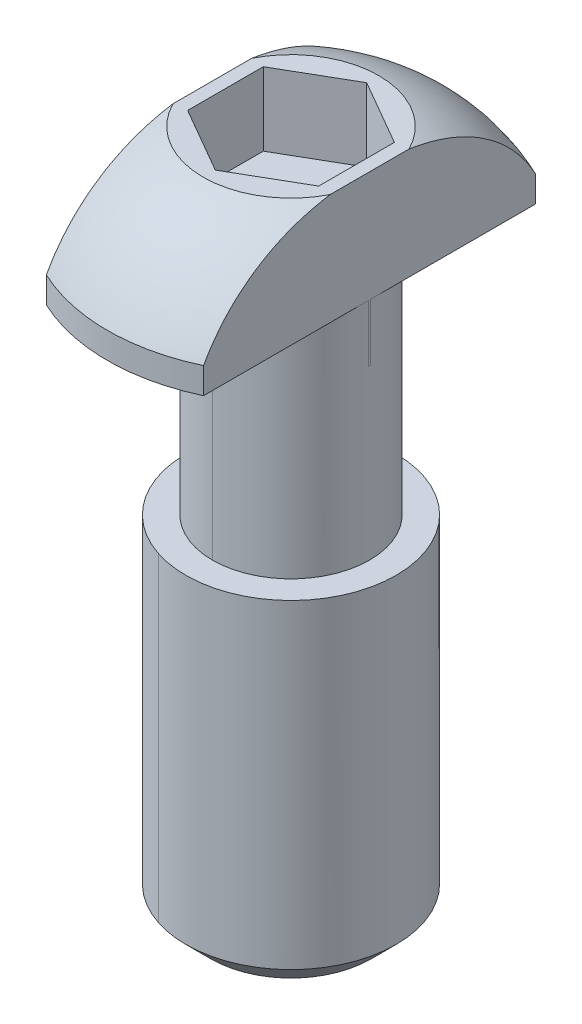
ISO-10303-21;
HEADER;
FILE_DESCRIPTION(('STEP AP214'),'2;1');
FILE_NAME('part.step','',(''),(''),'','','');
FILE_SCHEMA(('AUTOMOTIVE_DESIGN { 1 0 10303 214 1 1 1 1 }'));
ENDSEC;
DATA;
#1=APPLICATION_CONTEXT('core data for automotive mechanical design processes');
#2=APPLICATION_PROTOCOL_DEFINITION('international standard','automotive_design',2000,#1);
#3=PRODUCT_CONTEXT('',#1,'mechanical');
#4=PRODUCT('Part','Part','',(#3));
#5=PRODUCT_RELATED_PRODUCT_CATEGORY('part','',(#4));
#6=PRODUCT_DEFINITION_FORMATION('','',#4);
#7=PRODUCT_DEFINITION_CONTEXT('part definition',#1,'design');
#8=PRODUCT_DEFINITION('design','',#6,#7);
#9=PRODUCT_DEFINITION_SHAPE('','',#8);
#10=(LENGTH_UNIT() NAMED_UNIT(*) SI_UNIT(.MILLI.,.METRE.));
#11=(NAMED_UNIT(*) PLANE_ANGLE_UNIT() SI_UNIT($,.RADIAN.));
#12=(NAMED_UNIT(*) SI_UNIT($,.STERADIAN.) SOLID_ANGLE_UNIT());
#13=UNCERTAINTY_MEASURE_WITH_UNIT(LENGTH_MEASURE(1.E-05),#10,'distance_accuracy_value','');
#14=(GEOMETRIC_REPRESENTATION_CONTEXT(3) GLOBAL_UNCERTAINTY_ASSIGNED_CONTEXT((#13)) GLOBAL_UNIT_ASSIGNED_CONTEXT((#10,
#11,#12)) REPRESENTATION_CONTEXT('',''));
#15=CARTESIAN_POINT('',(0.,0.,0.));
#16=DIRECTION('',(0.,0.,1.));
#17=DIRECTION('',(1.,0.,0.));
#18=AXIS2_PLACEMENT_3D('',#15,#16,#17);
#19=CARTESIAN_POINT('',(0.,15.7755421503726,0.));
#20=DIRECTION('',(0.,-1.,0.));
#21=DIRECTION('',(0.,0.,1.));
#22=AXIS2_PLACEMENT_3D('',#19,#20,#21);
#23=DEGENERATE_TOROIDAL_SURFACE('',#22,0.988366273500756,5.0799999999994,.T.);
#24=CARTESIAN_POINT('',(2.375,18.01114,-5.01616138097649));
#25=CARTESIAN_POINT('',(2.375,18.296576088637,-4.86138537455025));
#26=CARTESIAN_POINT('',(2.375,18.5689443575255,-4.67488824016125));
#27=CARTESIAN_POINT('',(2.375,19.2212313011707,-4.12269419155696));
#28=CARTESIAN_POINT('',(2.375,19.5721331044173,-3.70706406030373));
#29=CARTESIAN_POINT('',(2.375,20.1286836369885,-2.78432721767959));
#30=CARTESIAN_POINT('',(2.375,20.3355947611015,-2.26376015241012));
#31=CARTESIAN_POINT('',(2.375,20.5097082248342,-1.5533172329614));
#32=CARTESIAN_POINT('',(2.375,20.5457387158703,-1.37075905535062));
#33=CARTESIAN_POINT('',(2.375,20.574,-1.18912975079946));
#34=B_SPLINE_CURVE_WITH_KNOTS('',3,(#24,#25,#26,#27,#28,#29,#30,#31,#32,#33),.UNSPECIFIED.,.F.,
.F.,(4,2,2,2,4),(0.,0.204715293386292,0.538826349685439,0.884108894617601,1.),.UNSPECIFIED.);
#35=CARTESIAN_POINT('',(2.375,18.01114,-5.01616138097649));
#36=VERTEX_POINT('',#35);
#37=CARTESIAN_POINT('',(2.375,20.574,-1.18912975079947));
#38=VERTEX_POINT('',#37);
#39=EDGE_CURVE('E11',#36,#38,#34,.T.);
#40=ORIENTED_EDGE('',*,*,#39,.F.);
#41=CARTESIAN_POINT('',(0.,18.01114,0.));
#42=DIRECTION('',(0.,-1.,0.));
#43=DIRECTION('',(0.,0.,-1.));
#44=AXIS2_PLACEMENT_3D('',#41,#42,#43);
#45=CIRCLE('',#44,5.55);
#46=CARTESIAN_POINT('',(-2.375,18.01114,-5.01616138097649));
#47=VERTEX_POINT('',#46);
#48=EDGE_CURVE('E25',#47,#36,#45,.T.);
#49=ORIENTED_EDGE('',*,*,#48,.F.);
#50=CARTESIAN_POINT('',(-2.375,20.574,-1.18912975079947));
#51=CARTESIAN_POINT('',(-2.375,20.5089898144888,-1.60693648346493));
#52=CARTESIAN_POINT('',(-2.375,20.4025539673415,-2.02614001549125));
#53=CARTESIAN_POINT('',(-2.375,20.0499067943608,-2.94622753582735));
#54=CARTESIAN_POINT('',(-2.375,19.7613219505825,-3.44693596717502));
#55=CARTESIAN_POINT('',(-2.375,19.0381711075084,-4.31048182302075));
#56=CARTESIAN_POINT('',(-2.375,18.5932028382873,-4.68481890109435));
#57=CARTESIAN_POINT('',(-2.375,18.0734367274535,-4.98191931533658));
#58=CARTESIAN_POINT('',(-2.375,18.0417829785444,-4.99954540972085));
#59=CARTESIAN_POINT('',(-2.375,18.01114,-5.01616138097649));
#60=B_SPLINE_CURVE_WITH_KNOTS('',3,(#50,#51,#52,#53,#54,#55,#56,#57,#58,#59),.UNSPECIFIED.,.F.,
.F.,(4,2,2,2,4),(0.,0.266934110498165,0.62205086055326,0.97799421636308,1.),.UNSPECIFIED.);
#61=CARTESIAN_POINT('',(-2.375,20.574,-1.18912975079947));
#62=VERTEX_POINT('',#61);
#63=EDGE_CURVE('E387',#62,#47,#60,.T.);
#64=ORIENTED_EDGE('',*,*,#63,.F.);
#65=CARTESIAN_POINT('',(0.,20.574,0.));
#66=DIRECTION('',(0.,-1.,0.));
#67=DIRECTION('',(0.,0.,-1.));
#68=AXIS2_PLACEMENT_3D('',#65,#66,#67);
#69=CIRCLE('',#68,2.65605997);
#70=EDGE_CURVE('E394',#62,#38,#69,.T.);
#71=ORIENTED_EDGE('',*,*,#70,.T.);
#72=EDGE_LOOP('',(#40,#49,#64,#71));
#73=FACE_BOUND('',#72,.T.);
#74=ADVANCED_FACE('F16',(#73),#23,.T.);
#75=CARTESIAN_POINT('',(0.,20.574,0.));
#76=DIRECTION('',(0.,-1.,0.));
#77=DIRECTION('',(0.,0.,-1.));
#78=AXIS2_PLACEMENT_3D('',#75,#76,#77);
#79=PLANE('',#78);
#80=DIRECTION('',(0.,0.,-1.));
#81=VECTOR('',#80,1.);
#82=CARTESIAN_POINT('',(2.375,20.574,0.));
#83=LINE('',#82,#81);
#84=CARTESIAN_POINT('',(2.375,20.574,1.18912975079947));
#85=VERTEX_POINT('',#84);
#86=EDGE_CURVE('E396',#85,#38,#83,.T.);
#87=ORIENTED_EDGE('',*,*,#86,.T.);
#88=ORIENTED_EDGE('',*,*,#70,.F.);
#89=DIRECTION('',(0.,0.,1.));
#90=VECTOR('',#89,1.);
#91=CARTESIAN_POINT('',(-2.375,20.574,0.));
#92=LINE('',#91,#90);
#93=CARTESIAN_POINT('',(-2.375,20.574,1.18912975079947));
#94=VERTEX_POINT('',#93);
#95=EDGE_CURVE('E391',#62,#94,#92,.T.);
#96=ORIENTED_EDGE('',*,*,#95,.T.);
#97=CARTESIAN_POINT('',(0.,20.574,0.));
#98=DIRECTION('',(0.,-1.,0.));
#99=DIRECTION('',(0.,0.,-1.));
#100=AXIS2_PLACEMENT_3D('',#97,#98,#99);
#101=CIRCLE('',#100,2.65605997);
#102=EDGE_CURVE('E425',#85,#94,#101,.T.);
#103=ORIENTED_EDGE('',*,*,#102,.F.);
#104=EDGE_LOOP('',(#87,#88,#96,#103));
#105=FACE_BOUND('',#104,.T.);
#106=DIRECTION('',(0.86602540378445,0.,-0.499999999999981));
#107=VECTOR('',#106,1.);
#108=CARTESIAN_POINT('',(0.,20.574,2.2863070659909));
#109=LINE('',#108,#107);
#110=CARTESIAN_POINT('',(0.,20.574,2.2863070659909));
#111=VERTEX_POINT('',#110);
#112=CARTESIAN_POINT('',(1.98,20.574,1.1431535329955));
#113=VERTEX_POINT('',#112);
#114=EDGE_CURVE('E430',#111,#113,#109,.T.);
#115=ORIENTED_EDGE('',*,*,#114,.F.);
#116=DIRECTION('',(0.86602540378445,0.,0.499999999999981));
#117=VECTOR('',#116,1.);
#118=CARTESIAN_POINT('',(-1.98,20.574,1.1431535329955));
#119=LINE('',#118,#117);
#120=CARTESIAN_POINT('',(-1.98,20.574,1.1431535329955));
#121=VERTEX_POINT('',#120);
#122=EDGE_CURVE('E435',#121,#111,#119,.T.);
#123=ORIENTED_EDGE('',*,*,#122,.F.);
#124=DIRECTION('',(0.,0.,1.));
#125=VECTOR('',#124,1.);
#126=CARTESIAN_POINT('',(-1.98,20.574,-1.1431535329955));
#127=LINE('',#126,#125);
#128=CARTESIAN_POINT('',(-1.98,20.574,-1.1431535329955));
#129=VERTEX_POINT('',#128);
#130=EDGE_CURVE('E440',#129,#121,#127,.T.);
#131=ORIENTED_EDGE('',*,*,#130,.F.);
#132=DIRECTION('',(-0.86602540378445,0.,0.499999999999981));
#133=VECTOR('',#132,1.);
#134=CARTESIAN_POINT('',(0.,20.574,-2.2863070659909));
#135=LINE('',#134,#133);
#136=CARTESIAN_POINT('',(0.,20.574,-2.2863070659909));
#137=VERTEX_POINT('',#136);
#138=EDGE_CURVE('E445',#137,#129,#135,.T.);
#139=ORIENTED_EDGE('',*,*,#138,.F.);
#140=DIRECTION('',(-0.86602540378445,0.,-0.499999999999981));
#141=VECTOR('',#140,1.);
#142=CARTESIAN_POINT('',(1.98,20.574,-1.1431535329955));
#143=LINE('',#142,#141);
#144=CARTESIAN_POINT('',(1.98,20.574,-1.1431535329955));
#145=VERTEX_POINT('',#144);
#146=EDGE_CURVE('E450',#145,#137,#143,.T.);
#147=ORIENTED_EDGE('',*,*,#146,.F.);
#148=DIRECTION('',(0.,0.,1.));
#149=VECTOR('',#148,1.);
#150=CARTESIAN_POINT('',(1.98,20.574,0.));
#151=LINE('',#150,#149);
#152=EDGE_CURVE('E455',#145,#113,#151,.T.);
#153=ORIENTED_EDGE('',*,*,#152,.T.);
#154=EDGE_LOOP('',(#115,#123,#131,#139,#147,#153));
#155=FACE_BOUND('',#154,.T.);
#156=ADVANCED_FACE('F568',(#105,#155),#79,.F.);
#157=CARTESIAN_POINT('',(1.98,18.3642,1.1431535329955));
#158=DIRECTION('',(1.,0.,0.));
#159=DIRECTION('',(0.,0.,-1.));
#160=AXIS2_PLACEMENT_3D('',#157,#158,#159);
#161=PLANE('',#160);
#162=DIRECTION('',(0.,1.,0.));
#163=VECTOR('',#162,1.);
#164=CARTESIAN_POINT('',(1.98,18.3642,1.1431535329955));
#165=LINE('',#164,#163);
#166=CARTESIAN_POINT('',(1.98,18.3642,1.1431535329955));
#167=VERTEX_POINT('',#166);
#168=EDGE_CURVE('E459',#167,#113,#165,.T.);
#169=ORIENTED_EDGE('',*,*,#168,.T.);
#170=ORIENTED_EDGE('',*,*,#152,.F.);
#171=DIRECTION('',(0.,1.,0.));
#172=VECTOR('',#171,1.);
#173=CARTESIAN_POINT('',(1.98,18.3642,-1.1431535329955));
#174=LINE('',#173,#172);
#175=CARTESIAN_POINT('',(1.98,18.3642,-1.1431535329955));
#176=VERTEX_POINT('',#175);
#177=EDGE_CURVE('E464',#176,#145,#174,.T.);
#178=ORIENTED_EDGE('',*,*,#177,.F.);
#179=DIRECTION('',(0.,0.,-1.));
#180=VECTOR('',#179,1.);
#181=CARTESIAN_POINT('',(1.98,18.3642,1.1431535329955));
#182=LINE('',#181,#180);
#183=EDGE_CURVE('E469',#167,#176,#182,.T.);
#184=ORIENTED_EDGE('',*,*,#183,.F.);
#185=EDGE_LOOP('',(#169,#170,#178,#184));
#186=FACE_BOUND('',#185,.T.);
#187=ADVANCED_FACE('F598',(#186),#161,.F.);
#188=CARTESIAN_POINT('',(0.,18.3642,0.));
#189=DIRECTION('',(0.,1.,0.));
#190=DIRECTION('',(0.,0.,1.));
#191=AXIS2_PLACEMENT_3D('',#188,#189,#190);
#192=PLANE('',#191);
#193=DIRECTION('',(0.,0.,1.));
#194=VECTOR('',#193,1.);
#195=CARTESIAN_POINT('',(-1.98,18.3642,-1.1431535329955));
#196=LINE('',#195,#194);
#197=CARTESIAN_POINT('',(-1.98,18.3642,-1.1431535329955));
#198=VERTEX_POINT('',#197);
#199=CARTESIAN_POINT('',(-1.98,18.3642,1.1431535329955));
#200=VERTEX_POINT('',#199);
#201=EDGE_CURVE('E474',#198,#200,#196,.T.);
#202=ORIENTED_EDGE('',*,*,#201,.T.);
#203=DIRECTION('',(0.86602540378445,0.,0.499999999999981));
#204=VECTOR('',#203,1.);
#205=CARTESIAN_POINT('',(-1.98,18.3642,1.1431535329955));
#206=LINE('',#205,#204);
#207=CARTESIAN_POINT('',(0.,18.3642,2.2863070659909));
#208=VERTEX_POINT('',#207);
#209=EDGE_CURVE('E478',#200,#208,#206,.T.);
#210=ORIENTED_EDGE('',*,*,#209,.T.);
#211=DIRECTION('',(0.86602540378445,0.,-0.499999999999981));
#212=VECTOR('',#211,1.);
#213=CARTESIAN_POINT('',(0.,18.3642,2.2863070659909));
#214=LINE('',#213,#212);
#215=EDGE_CURVE('E482',#208,#167,#214,.T.);
#216=ORIENTED_EDGE('',*,*,#215,.T.);
#217=ORIENTED_EDGE('',*,*,#183,.T.);
#218=DIRECTION('',(-0.86602540378445,0.,-0.499999999999981));
#219=VECTOR('',#218,1.);
#220=CARTESIAN_POINT('',(1.98,18.3642,-1.1431535329955));
#221=LINE('',#220,#219);
#222=CARTESIAN_POINT('',(0.,18.3642,-2.2863070659909));
#223=VERTEX_POINT('',#222);
#224=EDGE_CURVE('E487',#176,#223,#221,.T.);
#225=ORIENTED_EDGE('',*,*,#224,.T.);
#226=DIRECTION('',(-0.86602540378445,0.,0.499999999999981));
#227=VECTOR('',#226,1.);
#228=CARTESIAN_POINT('',(0.,18.3642,-2.2863070659909));
#229=LINE('',#228,#227);
#230=EDGE_CURVE('E491',#223,#198,#229,.T.);
#231=ORIENTED_EDGE('',*,*,#230,.T.);
#232=EDGE_LOOP('',(#202,#210,#216,#217,#225,#231));
#233=FACE_BOUND('',#232,.T.);
#234=ADVANCED_FACE('F602',(#233),#192,.T.);
#235=CARTESIAN_POINT('',(0.,18.3642,-2.2863070659909));
#236=DIRECTION('',(-0.499999999999981,0.,-0.86602540378445));
#237=DIRECTION('',(-0.86602540378445,0.,0.499999999999981));
#238=AXIS2_PLACEMENT_3D('',#235,#236,#237);
#239=PLANE('',#238);
#240=ORIENTED_EDGE('',*,*,#138,.T.);
#241=DIRECTION('',(0.,1.,0.));
#242=VECTOR('',#241,1.);
#243=CARTESIAN_POINT('',(-1.98,18.3642,-1.1431535329955));
#244=LINE('',#243,#242);
#245=EDGE_CURVE('E495',#198,#129,#244,.T.);
#246=ORIENTED_EDGE('',*,*,#245,.F.);
#247=ORIENTED_EDGE('',*,*,#230,.F.);
#248=DIRECTION('',(0.,1.,0.));
#249=VECTOR('',#248,1.);
#250=CARTESIAN_POINT('',(0.,18.3642,-2.2863070659909));
#251=LINE('',#250,#249);
#252=EDGE_CURVE('E500',#223,#137,#251,.T.);
#253=ORIENTED_EDGE('',*,*,#252,.T.);
#254=EDGE_LOOP('',(#240,#246,#247,#253));
#255=FACE_BOUND('',#254,.T.);
#256=ADVANCED_FACE('F608',(#255),#239,.F.);
#257=CARTESIAN_POINT('',(1.98,18.3642,-1.1431535329955));
#258=DIRECTION('',(0.499999999999981,0.,-0.86602540378445));
#259=DIRECTION('',(-0.86602540378445,0.,-0.499999999999981));
#260=AXIS2_PLACEMENT_3D('',#257,#258,#259);
#261=PLANE('',#260);
#262=ORIENTED_EDGE('',*,*,#146,.T.);
#263=ORIENTED_EDGE('',*,*,#252,.F.);
#264=ORIENTED_EDGE('',*,*,#224,.F.);
#265=ORIENTED_EDGE('',*,*,#177,.T.);
#266=EDGE_LOOP('',(#262,#263,#264,#265));
#267=FACE_BOUND('',#266,.T.);
#268=ADVANCED_FACE('F612',(#267),#261,.F.);
#269=CARTESIAN_POINT('',(-1.98,18.3642,-1.1431535329955));
#270=DIRECTION('',(-1.,0.,0.));
#271=DIRECTION('',(0.,0.,1.));
#272=AXIS2_PLACEMENT_3D('',#269,#270,#271);
#273=PLANE('',#272);
#274=ORIENTED_EDGE('',*,*,#130,.T.);
#275=DIRECTION('',(0.,1.,0.));
#276=VECTOR('',#275,1.);
#277=CARTESIAN_POINT('',(-1.98,18.3642,1.1431535329955));
#278=LINE('',#277,#276);
#279=EDGE_CURVE('E505',#200,#121,#278,.T.);
#280=ORIENTED_EDGE('',*,*,#279,.F.);
#281=ORIENTED_EDGE('',*,*,#201,.F.);
#282=ORIENTED_EDGE('',*,*,#245,.T.);
#283=EDGE_LOOP('',(#274,#280,#281,#282));
#284=FACE_BOUND('',#283,.T.);
#285=ADVANCED_FACE('F616',(#284),#273,.F.);
#286=CARTESIAN_POINT('',(-1.98,18.3642,1.1431535329955));
#287=DIRECTION('',(-0.499999999999981,0.,0.86602540378445));
#288=DIRECTION('',(0.86602540378445,0.,0.499999999999981));
#289=AXIS2_PLACEMENT_3D('',#286,#287,#288);
#290=PLANE('',#289);
#291=ORIENTED_EDGE('',*,*,#122,.T.);
#292=DIRECTION('',(0.,1.,0.));
#293=VECTOR('',#292,1.);
#294=CARTESIAN_POINT('',(0.,18.3642,2.2863070659909));
#295=LINE('',#294,#293);
#296=EDGE_CURVE('E510',#208,#111,#295,.T.);
#297=ORIENTED_EDGE('',*,*,#296,.F.);
#298=ORIENTED_EDGE('',*,*,#209,.F.);
#299=ORIENTED_EDGE('',*,*,#279,.T.);
#300=EDGE_LOOP('',(#291,#297,#298,#299));
#301=FACE_BOUND('',#300,.T.);
#302=ADVANCED_FACE('F619',(#301),#290,.F.);
#303=CARTESIAN_POINT('',(0.,18.3642,2.2863070659909));
#304=DIRECTION('',(0.499999999999981,0.,0.86602540378445));
#305=DIRECTION('',(0.86602540378445,0.,-0.499999999999981));
#306=AXIS2_PLACEMENT_3D('',#303,#304,#305);
#307=PLANE('',#306);
#308=ORIENTED_EDGE('',*,*,#114,.T.);
#309=ORIENTED_EDGE('',*,*,#168,.F.);
#310=ORIENTED_EDGE('',*,*,#215,.F.);
#311=ORIENTED_EDGE('',*,*,#296,.T.);
#312=EDGE_LOOP('',(#308,#309,#310,#311));
#313=FACE_BOUND('',#312,.T.);
#314=ADVANCED_FACE('F532',(#313),#307,.F.);
#315=CARTESIAN_POINT('',(0.,15.7755421503726,0.));
#316=DIRECTION('',(0.,-1.,0.));
#317=DIRECTION('',(0.,0.,-1.));
#318=AXIS2_PLACEMENT_3D('',#315,#316,#317);
#319=DEGENERATE_TOROIDAL_SURFACE('',#318,0.988366273500756,5.0799999999994,.T.);
#320=CARTESIAN_POINT('',(2.375,20.574,1.18912975079947));
#321=CARTESIAN_POINT('',(2.375,20.5089898144888,1.60693648346493));
#322=CARTESIAN_POINT('',(2.375,20.4025539673415,2.02614001549125));
#323=CARTESIAN_POINT('',(2.375,20.0499067943608,2.94622753582735));
#324=CARTESIAN_POINT('',(2.375,19.7613219505825,3.44693596717502));
#325=CARTESIAN_POINT('',(2.375,19.0381711075084,4.31048182302075));
#326=CARTESIAN_POINT('',(2.375,18.5932028382873,4.68481890109435));
#327=CARTESIAN_POINT('',(2.375,18.0734367274535,4.98191931533658));
#328=CARTESIAN_POINT('',(2.375,18.0417829785444,4.99954540972085));
#329=CARTESIAN_POINT('',(2.375,18.01114,5.01616138097649));
#330=B_SPLINE_CURVE_WITH_KNOTS('',3,(#320,#321,#322,#323,#324,#325,#326,#327,#328,#329),
.UNSPECIFIED.,.F.,.F.,(4,2,2,2,4),(0.,0.266934110498165,0.62205086055326,0.97799421636308,1.),.UNSPECIFIED.);
#331=CARTESIAN_POINT('',(2.375,18.01114,5.01616138097649));
#332=VERTEX_POINT('',#331);
#333=EDGE_CURVE('E515',#85,#332,#330,.T.);
#334=ORIENTED_EDGE('',*,*,#333,.F.);
#335=ORIENTED_EDGE('',*,*,#102,.T.);
#336=CARTESIAN_POINT('',(-2.375,18.01114,5.01616138097649));
#337=CARTESIAN_POINT('',(-2.375,18.296576088637,4.86138537455025));
#338=CARTESIAN_POINT('',(-2.375,18.5689443575255,4.67488824016125));
#339=CARTESIAN_POINT('',(-2.375,19.2212313011707,4.12269419155696));
#340=CARTESIAN_POINT('',(-2.375,19.5721331044173,3.70706406030373));
#341=CARTESIAN_POINT('',(-2.375,20.1286836369885,2.78432721767959));
#342=CARTESIAN_POINT('',(-2.375,20.3355947611015,2.26376015241012));
#343=CARTESIAN_POINT('',(-2.375,20.5097082248342,1.5533172329614));
#344=CARTESIAN_POINT('',(-2.375,20.5457387158703,1.37075905535062));
#345=CARTESIAN_POINT('',(-2.375,20.574,1.18912975079946));
#346=B_SPLINE_CURVE_WITH_KNOTS('',3,(#336,#337,#338,#339,#340,#341,#342,#343,#344,#345),
.UNSPECIFIED.,.F.,.F.,(4,2,2,2,4),(0.,0.204715293386292,0.538826349685439,0.884108894617601,1.),.UNSPECIFIED.);
#347=CARTESIAN_POINT('',(-2.375,18.01114,5.01616138097649));
#348=VERTEX_POINT('',#347);
#349=EDGE_CURVE('E548',#348,#94,#346,.T.);
#350=ORIENTED_EDGE('',*,*,#349,.F.);
#351=CARTESIAN_POINT('',(0.,18.01114,0.));
#352=DIRECTION('',(0.,-1.,0.));
#353=DIRECTION('',(0.,0.,-1.));
#354=AXIS2_PLACEMENT_3D('',#351,#352,#353);
#355=CIRCLE('',#354,5.55);
#356=EDGE_CURVE('E545',#332,#348,#355,.T.);
#357=ORIENTED_EDGE('',*,*,#356,.F.);
#358=EDGE_LOOP('',(#334,#335,#350,#357));
#359=FACE_BOUND('',#358,.T.);
#360=ADVANCED_FACE('F523',(#359),#319,.T.);
#361=CARTESIAN_POINT('',(0.,0.,0.));
#362=DIRECTION('',(0.,-1.,0.));
#363=DIRECTION('',(0.,0.,-1.));
#364=AXIS2_PLACEMENT_3D('',#361,#362,#363);
#365=CYLINDRICAL_SURFACE('',#364,5.55);
#366=CARTESIAN_POINT('',(0.,17.22374,0.));
#367=DIRECTION('',(0.,-1.,0.));
#368=DIRECTION('',(0.,0.,-1.));
#369=AXIS2_PLACEMENT_3D('',#366,#367,#368);
#370=CIRCLE('',#369,5.55);
#371=CARTESIAN_POINT('',(2.375,17.22374,5.01616138097649));
#372=VERTEX_POINT('',#371);
#373=CARTESIAN_POINT('',(-2.375,17.22374,5.01616138097649));
#374=VERTEX_POINT('',#373);
#375=EDGE_CURVE('E549',#372,#374,#370,.T.);
#376=ORIENTED_EDGE('',*,*,#375,.F.);
#377=DIRECTION('',(0.,1.,0.));
#378=VECTOR('',#377,1.);
#379=CARTESIAN_POINT('',(2.375,0.,5.01616138097649));
#380=LINE('',#379,#378);
#381=EDGE_CURVE('E554',#372,#332,#380,.T.);
#382=ORIENTED_EDGE('',*,*,#381,.T.);
#383=ORIENTED_EDGE('',*,*,#356,.T.);
#384=DIRECTION('',(0.,-1.,0.));
#385=VECTOR('',#384,1.);
#386=CARTESIAN_POINT('',(-2.375,0.,5.01616138097649));
#387=LINE('',#386,#385);
#388=EDGE_CURVE('E559',#348,#374,#387,.T.);
#389=ORIENTED_EDGE('',*,*,#388,.T.);
#390=EDGE_LOOP('',(#376,#382,#383,#389));
#391=FACE_BOUND('',#390,.T.);
#392=ADVANCED_FACE('F338',(#391),#365,.T.);
#393=CARTESIAN_POINT('',(-2.375,25.654,-6.35));
#394=DIRECTION('',(1.,0.,0.));
#395=DIRECTION('',(0.,0.,-1.));
#396=AXIS2_PLACEMENT_3D('',#393,#394,#395);
#397=PLANE('',#396);
#398=DIRECTION('',(0.,0.,-1.));
#399=VECTOR('',#398,1.);
#400=CARTESIAN_POINT('',(-2.375,17.22374,0.));
#401=LINE('',#400,#399);
#402=CARTESIAN_POINT('',(-2.375,17.22374,0.0305852297919852));
#403=VERTEX_POINT('',#402);
#404=EDGE_CURVE('E376',#374,#403,#401,.T.);
#405=ORIENTED_EDGE('',*,*,#404,.F.);
#406=ORIENTED_EDGE('',*,*,#388,.F.);
#407=ORIENTED_EDGE('',*,*,#349,.T.);
#408=ORIENTED_EDGE('',*,*,#95,.F.);
#409=ORIENTED_EDGE('',*,*,#63,.T.);
#410=DIRECTION('',(0.,1.,0.));
#411=VECTOR('',#410,1.);
#412=CARTESIAN_POINT('',(-2.375,0.,-5.01616138097649));
#413=LINE('',#412,#411);
#414=CARTESIAN_POINT('',(-2.375,17.22374,-5.01616138097649));
#415=VERTEX_POINT('',#414);
#416=EDGE_CURVE('E372',#415,#47,#413,.T.);
#417=ORIENTED_EDGE('',*,*,#416,.F.);
#418=DIRECTION('',(0.,0.,-1.));
#419=VECTOR('',#418,1.);
#420=CARTESIAN_POINT('',(-2.375,17.22374,0.));
#421=LINE('',#420,#419);
#422=CARTESIAN_POINT('',(-2.375,17.22374,-0.0305852297919437));
#423=VERTEX_POINT('',#422);
#424=EDGE_CURVE('E367',#423,#415,#421,.T.);
#425=ORIENTED_EDGE('',*,*,#424,.F.);
#426=DIRECTION('',(0.,1.,0.));
#427=VECTOR('',#426,1.);
#428=CARTESIAN_POINT('',(-2.375,0.,-0.0305852297919437));
#429=LINE('',#428,#427);
#430=CARTESIAN_POINT('',(-2.375,15.494,-0.0305852297919437));
#431=VERTEX_POINT('',#430);
#432=EDGE_CURVE('E364',#431,#423,#429,.T.);
#433=ORIENTED_EDGE('',*,*,#432,.F.);
#434=CARTESIAN_POINT('',(-2.375,15.494,-0.0305852297919395));
#435=DIRECTION('',(0.,0.,1.));
#436=VECTOR('',#435,1.);
#437=LINE('',#434,#436);
#438=CARTESIAN_POINT('',(-2.375,15.494,0.0305852297919437));
#439=VERTEX_POINT('',#438);
#440=EDGE_CURVE('E362',#431,#439,#437,.T.);
#441=ORIENTED_EDGE('',*,*,#440,.T.);
#442=DIRECTION('',(0.,-1.,0.));
#443=VECTOR('',#442,1.);
#444=CARTESIAN_POINT('',(-2.375,0.,0.0305852297919437));
#445=LINE('',#444,#443);
#446=EDGE_CURVE('E869',#403,#439,#445,.T.);
#447=ORIENTED_EDGE('',*,*,#446,.F.);
#448=EDGE_LOOP('',(#405,#406,#407,#408,#409,#417,#425,#433,#441,#447));
#449=FACE_BOUND('',#448,.T.);
#450=ADVANCED_FACE('F333',(#449),#397,.F.);
#451=CARTESIAN_POINT('',(0.,0.,0.));
#452=DIRECTION('',(0.,-1.,0.));
#453=DIRECTION('',(1.,0.,0.));
#454=AXIS2_PLACEMENT_3D('',#451,#452,#453);
#455=CYLINDRICAL_SURFACE('',#454,2.37519693);
#456=DIRECTION('',(0.,-1.,0.));
#457=VECTOR('',#456,1.);
#458=CARTESIAN_POINT('',(0.,17.22374,2.37519693));
#459=LINE('',#458,#457);
#460=CARTESIAN_POINT('',(0.,17.22374,2.37519693));
#461=VERTEX_POINT('',#460);
#462=CARTESIAN_POINT('',(0.,10.414,2.37519693));
#463=VERTEX_POINT('',#462);
#464=EDGE_CURVE('E582',#461,#463,#459,.T.);
#465=ORIENTED_EDGE('',*,*,#464,.F.);
#466=CARTESIAN_POINT('',(0.,17.22374,0.));
#467=DIRECTION('',(0.,-1.,0.));
#468=DIRECTION('',(0.,0.,-1.));
#469=AXIS2_PLACEMENT_3D('',#466,#467,#468);
#470=CIRCLE('',#469,2.37519693);
#471=EDGE_CURVE('E313',#461,#403,#470,.T.);
#472=ORIENTED_EDGE('',*,*,#471,.T.);
#473=ORIENTED_EDGE('',*,*,#446,.T.);
#474=ORIENTED_EDGE('',*,*,#440,.F.);
#475=ORIENTED_EDGE('',*,*,#432,.T.);
#476=CARTESIAN_POINT('',(0.,17.22374,0.));
#477=DIRECTION('',(0.,-1.,0.));
#478=DIRECTION('',(0.,0.,-1.));
#479=AXIS2_PLACEMENT_3D('',#476,#477,#478);
#480=CIRCLE('',#479,2.37519693);
#481=CARTESIAN_POINT('',(0.,17.22374,-2.37519693));
#482=VERTEX_POINT('',#481);
#483=EDGE_CURVE('E309',#423,#482,#480,.T.);
#484=ORIENTED_EDGE('',*,*,#483,.T.);
#485=DIRECTION('',(0.,-1.,0.));
#486=VECTOR('',#485,1.);
#487=CARTESIAN_POINT('',(0.,17.22374,-2.37519693));
#488=LINE('',#487,#486);
#489=CARTESIAN_POINT('',(0.,10.414,-2.37519693));
#490=VERTEX_POINT('',#489);
#491=EDGE_CURVE('E305',#482,#490,#488,.T.);
#492=ORIENTED_EDGE('',*,*,#491,.T.);
#493=CARTESIAN_POINT('',(0.,10.414,0.));
#494=DIRECTION('',(0.,-1.,0.));
#495=DIRECTION('',(0.,0.,-1.));
#496=AXIS2_PLACEMENT_3D('',#493,#494,#495);
#497=CIRCLE('',#496,2.37519693);
#498=EDGE_CURVE('E300',#463,#490,#497,.T.);
#499=ORIENTED_EDGE('',*,*,#498,.F.);
#500=EDGE_LOOP('',(#465,#472,#473,#474,#475,#484,#492,#499));
#501=FACE_BOUND('',#500,.T.);
#502=ADVANCED_FACE('F322',(#501),#455,.T.);
#503=CARTESIAN_POINT('',(2.37519693,10.414,0.));
#504=DIRECTION('',(0.,-1.,0.));
#505=DIRECTION('',(0.,0.,-1.));
#506=AXIS2_PLACEMENT_3D('',#503,#504,#505);
#507=PLANE('',#506);
#508=CARTESIAN_POINT('',(0.,10.414,0.));
#509=DIRECTION('',(0.,-1.,0.));
#510=DIRECTION('',(0.,0.,-1.));
#511=AXIS2_PLACEMENT_3D('',#508,#509,#510);
#512=CIRCLE('',#511,3.175);
#513=CARTESIAN_POINT('',(-0.981128957140458,10.414,3.01960443923711));
#514=VERTEX_POINT('',#513);
#515=CARTESIAN_POINT('',(0.,10.414,-3.175));
#516=VERTEX_POINT('',#515);
#517=EDGE_CURVE('E295',#514,#516,#512,.T.);
#518=ORIENTED_EDGE('',*,*,#517,.F.);
#519=CARTESIAN_POINT('',(0.,10.414,0.));
#520=DIRECTION('',(0.,-1.,0.));
#521=DIRECTION('',(0.,0.,-1.));
#522=AXIS2_PLACEMENT_3D('',#519,#520,#521);
#523=CIRCLE('',#522,3.175);
#524=EDGE_CURVE('E290',#516,#514,#523,.T.);
#525=ORIENTED_EDGE('',*,*,#524,.F.);
#526=EDGE_LOOP('',(#518,#525));
#527=FACE_BOUND('',#526,.T.);
#528=CARTESIAN_POINT('',(0.,10.414,0.));
#529=DIRECTION('',(0.,-1.,0.));
#530=DIRECTION('',(0.,0.,-1.));
#531=AXIS2_PLACEMENT_3D('',#528,#529,#530);
#532=CIRCLE('',#531,2.37519693);
#533=EDGE_CURVE('E285',#490,#463,#532,.T.);
#534=ORIENTED_EDGE('',*,*,#533,.T.);
#535=ORIENTED_EDGE('',*,*,#498,.T.);
#536=EDGE_LOOP('',(#534,#535));
#537=FACE_BOUND('',#536,.T.);
#538=ADVANCED_FACE('F332',(#527,#537),#507,.F.);
#539=CARTESIAN_POINT('',(0.,0.,0.));
#540=DIRECTION('',(0.,-1.,0.));
#541=DIRECTION('',(-1.,0.,0.));
#542=AXIS2_PLACEMENT_3D('',#539,#540,#541);
#543=CYLINDRICAL_SURFACE('',#542,2.37519693);
#544=ORIENTED_EDGE('',*,*,#464,.T.);
#545=ORIENTED_EDGE('',*,*,#533,.F.);
#546=ORIENTED_EDGE('',*,*,#491,.F.);
#547=CARTESIAN_POINT('',(0.,17.22374,0.));
#548=DIRECTION('',(0.,-1.,0.));
#549=DIRECTION('',(0.,0.,-1.));
#550=AXIS2_PLACEMENT_3D('',#547,#548,#549);
#551=CIRCLE('',#550,2.37519693);
#552=CARTESIAN_POINT('',(2.375,17.22374,-0.0305852297919437));
#553=VERTEX_POINT('',#552);
#554=EDGE_CURVE('E281',#482,#553,#551,.T.);
#555=ORIENTED_EDGE('',*,*,#554,.T.);
#556=DIRECTION('',(0.,-1.,0.));
#557=VECTOR('',#556,1.);
#558=CARTESIAN_POINT('',(2.375,0.,-0.0305852297919437));
#559=LINE('',#558,#557);
#560=CARTESIAN_POINT('',(2.375,15.494,-0.0305852297919437));
#561=VERTEX_POINT('',#560);
#562=EDGE_CURVE('E277',#553,#561,#559,.T.);
#563=ORIENTED_EDGE('',*,*,#562,.T.);
#564=CARTESIAN_POINT('',(0.,15.494,0.));
#565=DIRECTION('',(0.,1.,0.));
#566=DIRECTION('',(0.,0.,1.));
#567=AXIS2_PLACEMENT_3D('',#564,#565,#566);
#568=CIRCLE('',#567,2.37519693);
#569=CARTESIAN_POINT('',(2.375,15.494,0.0305852297919437));
#570=VERTEX_POINT('',#569);
#571=EDGE_CURVE('E272',#570,#561,#568,.T.);
#572=ORIENTED_EDGE('',*,*,#571,.F.);
#573=DIRECTION('',(0.,1.,0.));
#574=VECTOR('',#573,1.);
#575=CARTESIAN_POINT('',(2.375,0.,0.0305852297919437));
#576=LINE('',#575,#574);
#577=CARTESIAN_POINT('',(2.375,17.22374,0.0305852297919437));
#578=VERTEX_POINT('',#577);
#579=EDGE_CURVE('E268',#570,#578,#576,.T.);
#580=ORIENTED_EDGE('',*,*,#579,.T.);
#581=CARTESIAN_POINT('',(0.,17.22374,0.));
#582=DIRECTION('',(0.,-1.,0.));
#583=DIRECTION('',(0.,0.,-1.));
#584=AXIS2_PLACEMENT_3D('',#581,#582,#583);
#585=CIRCLE('',#584,2.37519693);
#586=EDGE_CURVE('E263',#578,#461,#585,.T.);
#587=ORIENTED_EDGE('',*,*,#586,.T.);
#588=EDGE_LOOP('',(#544,#545,#546,#555,#563,#572,#580,#587));
#589=FACE_BOUND('',#588,.T.);
#590=ADVANCED_FACE('F580',(#589),#543,.T.);
#591=CARTESIAN_POINT('',(5.55,17.22374,0.));
#592=DIRECTION('',(0.,1.,0.));
#593=DIRECTION('',(0.,0.,1.));
#594=AXIS2_PLACEMENT_3D('',#591,#592,#593);
#595=PLANE('',#594);
#596=ORIENTED_EDGE('',*,*,#471,.F.);
#597=ORIENTED_EDGE('',*,*,#586,.F.);
#598=DIRECTION('',(0.,0.,1.));
#599=VECTOR('',#598,1.);
#600=CARTESIAN_POINT('',(2.375,17.22374,0.));
#601=LINE('',#600,#599);
#602=EDGE_CURVE('E258',#578,#372,#601,.T.);
#603=ORIENTED_EDGE('',*,*,#602,.T.);
#604=ORIENTED_EDGE('',*,*,#375,.T.);
#605=ORIENTED_EDGE('',*,*,#404,.T.);
#606=EDGE_LOOP('',(#596,#597,#603,#604,#605));
#607=FACE_BOUND('',#606,.T.);
#608=ADVANCED_FACE('F236',(#607),#595,.F.);
#609=CARTESIAN_POINT('',(2.375,25.654,6.35));
#610=DIRECTION('',(-1.,0.,0.));
#611=DIRECTION('',(0.,0.,1.));
#612=AXIS2_PLACEMENT_3D('',#609,#610,#611);
#613=PLANE('',#612);
#614=DIRECTION('',(0.,0.,1.));
#615=VECTOR('',#614,1.);
#616=CARTESIAN_POINT('',(2.375,17.22374,0.));
#617=LINE('',#616,#615);
#618=CARTESIAN_POINT('',(2.375,17.22374,-5.01616138097649));
#619=VERTEX_POINT('',#618);
#620=EDGE_CURVE('E253',#619,#553,#617,.T.);
#621=ORIENTED_EDGE('',*,*,#620,.F.);
#622=DIRECTION('',(0.,-1.,0.));
#623=VECTOR('',#622,1.);
#624=CARTESIAN_POINT('',(2.375,0.,-5.01616138097649));
#625=LINE('',#624,#623);
#626=EDGE_CURVE('E216',#36,#619,#625,.T.);
#627=ORIENTED_EDGE('',*,*,#626,.F.);
#628=ORIENTED_EDGE('',*,*,#39,.T.);
#629=ORIENTED_EDGE('',*,*,#86,.F.);
#630=ORIENTED_EDGE('',*,*,#333,.T.);
#631=ORIENTED_EDGE('',*,*,#381,.F.);
#632=ORIENTED_EDGE('',*,*,#602,.F.);
#633=ORIENTED_EDGE('',*,*,#579,.F.);
#634=DIRECTION('',(0.,0.,-1.));
#635=VECTOR('',#634,1.);
#636=CARTESIAN_POINT('',(2.375,15.494,6.35));
#637=LINE('',#636,#635);
#638=EDGE_CURVE('E211',#570,#561,#637,.T.);
#639=ORIENTED_EDGE('',*,*,#638,.T.);
#640=ORIENTED_EDGE('',*,*,#562,.F.);
#641=EDGE_LOOP('',(#621,#627,#628,#629,#630,#631,#632,#633,#639,#640));
#642=FACE_BOUND('',#641,.T.);
#643=ADVANCED_FACE('F225',(#642),#613,.F.);
#644=CARTESIAN_POINT('',(0.,15.494,0.));
#645=DIRECTION('',(0.,1.,0.));
#646=DIRECTION('',(0.,0.,1.));
#647=AXIS2_PLACEMENT_3D('',#644,#645,#646);
#648=PLANE('',#647);
#649=ORIENTED_EDGE('',*,*,#638,.F.);
#650=ORIENTED_EDGE('',*,*,#571,.T.);
#651=EDGE_LOOP('',(#649,#650));
#652=FACE_BOUND('',#651,.T.);
#653=ADVANCED_FACE('F235',(#652),#648,.T.);
#654=CARTESIAN_POINT('',(0.,0.,0.));
#655=DIRECTION('',(0.,-1.,0.));
#656=DIRECTION('',(0.,0.,1.));
#657=AXIS2_PLACEMENT_3D('',#654,#655,#656);
#658=CYLINDRICAL_SURFACE('',#657,5.55);
#659=ORIENTED_EDGE('',*,*,#48,.T.);
#660=ORIENTED_EDGE('',*,*,#626,.T.);
#661=CARTESIAN_POINT('',(0.,17.22374,0.));
#662=DIRECTION('',(0.,-1.,0.));
#663=DIRECTION('',(0.,0.,-1.));
#664=AXIS2_PLACEMENT_3D('',#661,#662,#663);
#665=CIRCLE('',#664,5.55);
#666=EDGE_CURVE('E206',#415,#619,#665,.T.);
#667=ORIENTED_EDGE('',*,*,#666,.F.);
#668=ORIENTED_EDGE('',*,*,#416,.T.);
#669=EDGE_LOOP('',(#659,#660,#667,#668));
#670=FACE_BOUND('',#669,.T.);
#671=ADVANCED_FACE('F587',(#670),#658,.T.);
#672=CARTESIAN_POINT('',(5.55,17.22374,0.));
#673=DIRECTION('',(0.,1.,0.));
#674=DIRECTION('',(0.,0.,1.));
#675=AXIS2_PLACEMENT_3D('',#672,#673,#674);
#676=PLANE('',#675);
#677=ORIENTED_EDGE('',*,*,#666,.T.);
#678=ORIENTED_EDGE('',*,*,#620,.T.);
#679=ORIENTED_EDGE('',*,*,#554,.F.);
#680=ORIENTED_EDGE('',*,*,#483,.F.);
#681=ORIENTED_EDGE('',*,*,#424,.T.);
#682=EDGE_LOOP('',(#677,#678,#679,#680,#681));
#683=FACE_BOUND('',#682,.T.);
#684=ADVANCED_FACE('F592',(#683),#676,.F.);
#685=CARTESIAN_POINT('',(0.,0.,0.));
#686=DIRECTION('',(0.,-1.,0.));
#687=DIRECTION('',(-0.987688340595138,0.,-0.156434465040231));
#688=AXIS2_PLACEMENT_3D('',#685,#686,#687);
#689=CYLINDRICAL_SURFACE('',#688,3.175);
#690=DIRECTION('',(0.,-1.,0.));
#691=VECTOR('',#690,1.);
#692=CARTESIAN_POINT('',(-0.981128957140458,10.414,3.01960443923711));
#693=LINE('',#692,#691);
#694=CARTESIAN_POINT('',(-0.981128957140458,0.755649999999999,3.01960443923711));
#695=VERTEX_POINT('',#694);
#696=EDGE_CURVE('E202',#514,#695,#693,.T.);
#697=ORIENTED_EDGE('',*,*,#696,.T.);
#698=CARTESIAN_POINT('',(0.,0.75565,0.));
#699=DIRECTION('',(0.,-1.,0.));
#700=DIRECTION('',(0.,0.,-1.));
#701=AXIS2_PLACEMENT_3D('',#698,#699,#700);
#702=CIRCLE('',#701,3.175);
#703=CARTESIAN_POINT('',(0.,0.75565,3.175));
#704=VERTEX_POINT('',#703);
#705=EDGE_CURVE('E198',#704,#695,#702,.T.);
#706=ORIENTED_EDGE('',*,*,#705,.F.);
#707=CARTESIAN_POINT('',(0.,0.75565,0.));
#708=DIRECTION('',(0.,-1.,0.));
#709=DIRECTION('',(0.,0.,-1.));
#710=AXIS2_PLACEMENT_3D('',#707,#708,#709);
#711=CIRCLE('',#710,3.175);
#712=CARTESIAN_POINT('',(0.,0.75565,-3.175));
#713=VERTEX_POINT('',#712);
#714=EDGE_CURVE('E176',#713,#704,#711,.T.);
#715=ORIENTED_EDGE('',*,*,#714,.F.);
#716=DIRECTION('',(0.,-1.,0.));
#717=VECTOR('',#716,1.);
#718=CARTESIAN_POINT('',(0.,10.414,-3.175));
#719=LINE('',#718,#717);
#720=EDGE_CURVE('E190',#516,#713,#719,.T.);
#721=ORIENTED_EDGE('',*,*,#720,.F.);
#722=ORIENTED_EDGE('',*,*,#524,.T.);
#723=EDGE_LOOP('',(#697,#706,#715,#721,#722));
#724=FACE_BOUND('',#723,.T.);
#725=ADVANCED_FACE('F705',(#724),#689,.T.);
#726=CARTESIAN_POINT('',(0.,0.,0.));
#727=DIRECTION('',(0.,-1.,0.));
#728=DIRECTION('',(0.987688340595138,0.,0.156434465040231));
#729=AXIS2_PLACEMENT_3D('',#726,#727,#728);
#730=CYLINDRICAL_SURFACE('',#729,3.175);
#731=ORIENTED_EDGE('',*,*,#696,.F.);
#732=ORIENTED_EDGE('',*,*,#517,.T.);
#733=ORIENTED_EDGE('',*,*,#720,.T.);
#734=CARTESIAN_POINT('',(0.,0.75565,0.));
#735=DIRECTION('',(0.,-1.,0.));
#736=DIRECTION('',(0.,0.,-1.));
#737=AXIS2_PLACEMENT_3D('',#734,#735,#736);
#738=CIRCLE('',#737,3.175);
#739=EDGE_CURVE('E186',#695,#713,#738,.T.);
#740=ORIENTED_EDGE('',*,*,#739,.F.);
#741=EDGE_LOOP('',(#731,#732,#733,#740));
#742=FACE_BOUND('',#741,.T.);
#743=ADVANCED_FACE('F716',(#742),#730,.T.);
#744=CARTESIAN_POINT('',(0.,0.75565,0.));
#745=DIRECTION('',(0.,1.,0.));
#746=DIRECTION('',(1.,0.,0.));
#747=AXIS2_PLACEMENT_3D('',#744,#745,#746);
#748=CONICAL_SURFACE('',#747,3.175,0.785398163397448);
#749=DIRECTION('',(0.,0.707106781186548,-0.707106781186547));
#750=VECTOR('',#749,1.);
#751=CARTESIAN_POINT('',(0.,0.,-2.41935));
#752=LINE('',#751,#750);
#753=CARTESIAN_POINT('',(0.,0.,-2.41935));
#754=VERTEX_POINT('',#753);
#755=EDGE_CURVE('E167',#754,#713,#752,.T.);
#756=ORIENTED_EDGE('',*,*,#755,.F.);
#757=CARTESIAN_POINT('',(0.,0.,0.));
#758=DIRECTION('',(0.,-1.,0.));
#759=DIRECTION('',(0.,0.,-1.));
#760=AXIS2_PLACEMENT_3D('',#757,#758,#759);
#761=CIRCLE('',#760,2.41935);
#762=CARTESIAN_POINT('',(0.,0.,2.41935));
#763=VERTEX_POINT('',#762);
#764=EDGE_CURVE('E158',#763,#754,#761,.T.);
#765=ORIENTED_EDGE('',*,*,#764,.F.);
#766=DIRECTION('',(0.,0.707106781186548,0.707106781186547));
#767=VECTOR('',#766,1.);
#768=CARTESIAN_POINT('',(0.,0.,2.41935));
#769=LINE('',#768,#767);
#770=EDGE_CURVE('E163',#763,#704,#769,.T.);
#771=ORIENTED_EDGE('',*,*,#770,.T.);
#772=ORIENTED_EDGE('',*,*,#705,.T.);
#773=ORIENTED_EDGE('',*,*,#739,.T.);
#774=EDGE_LOOP('',(#756,#765,#771,#772,#773));
#775=FACE_BOUND('',#774,.T.);
#776=ADVANCED_FACE('F160',(#775),#748,.T.);
#777=CARTESIAN_POINT('',(0.,0.75565,0.));
#778=DIRECTION('',(0.,1.,0.));
#779=DIRECTION('',(-1.,0.,0.));
#780=AXIS2_PLACEMENT_3D('',#777,#778,#779);
#781=CONICAL_SURFACE('',#780,3.175,0.785398163397448);
#782=ORIENTED_EDGE('',*,*,#755,.T.);
#783=ORIENTED_EDGE('',*,*,#714,.T.);
#784=ORIENTED_EDGE('',*,*,#770,.F.);
#785=CARTESIAN_POINT('',(0.,0.,0.));
#786=DIRECTION('',(0.,-1.,0.));
#787=DIRECTION('',(0.,0.,-1.));
#788=AXIS2_PLACEMENT_3D('',#785,#786,#787);
#789=CIRCLE('',#788,2.41935);
#790=EDGE_CURVE('E171',#754,#763,#789,.T.);
#791=ORIENTED_EDGE('',*,*,#790,.F.);
#792=EDGE_LOOP('',(#782,#783,#784,#791));
#793=FACE_BOUND('',#792,.T.);
#794=ADVANCED_FACE('F175',(#793),#781,.T.);
#795=CARTESIAN_POINT('',(2.41935,0.,0.));
#796=DIRECTION('',(0.,1.,0.));
#797=DIRECTION('',(0.,0.,1.));
#798=AXIS2_PLACEMENT_3D('',#795,#796,#797);
#799=PLANE('',#798);
#800=ORIENTED_EDGE('',*,*,#790,.T.);
#801=ORIENTED_EDGE('',*,*,#764,.T.);
#802=EDGE_LOOP('',(#800,#801));
#803=FACE_BOUND('',#802,.T.);
#804=ADVANCED_FACE('F172',(#803),#799,.F.);
#805=CLOSED_SHELL('',(#74,#156,#187,#234,#256,#268,#285,#302,#314,#360,#392,#450,#502,#538,#590,
#608,#643,#653,#671,#684,#725,#743,#776,#794,#804));
#806=MANIFOLD_SOLID_BREP('B1',#805);
#807=ADVANCED_BREP_SHAPE_REPRESENTATION('',(#18,#806),#14);
#808=SHAPE_DEFINITION_REPRESENTATION(#9,#807);
ENDSEC;
END-ISO-10303-21;
